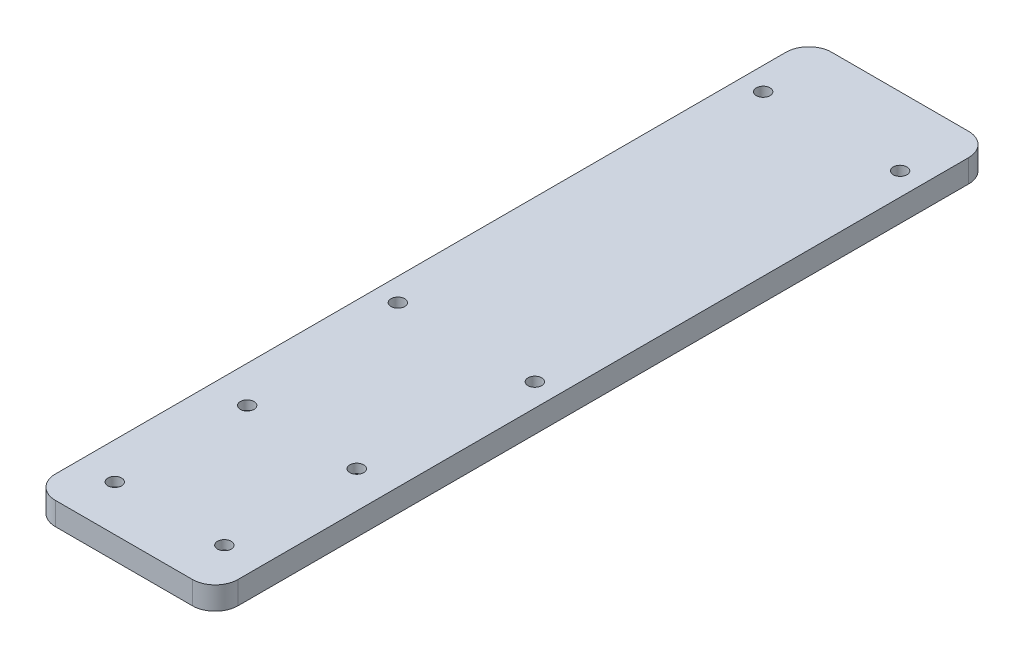
ISO-10303-21;
HEADER;
FILE_DESCRIPTION(('STEP AP214'),'2;1');
FILE_NAME('part.step','',(''),(''),'','','');
FILE_SCHEMA(('AUTOMOTIVE_DESIGN { 1 0 10303 214 1 1 1 1 }'));
ENDSEC;
DATA;
#1=APPLICATION_CONTEXT('core data for automotive mechanical design processes');
#2=APPLICATION_PROTOCOL_DEFINITION('international standard','automotive_design',2000,#1);
#3=PRODUCT_CONTEXT('',#1,'mechanical');
#4=PRODUCT('Part','Part','',(#3));
#5=PRODUCT_RELATED_PRODUCT_CATEGORY('part','',(#4));
#6=PRODUCT_DEFINITION_FORMATION('','',#4);
#7=PRODUCT_DEFINITION_CONTEXT('part definition',#1,'design');
#8=PRODUCT_DEFINITION('design','',#6,#7);
#9=PRODUCT_DEFINITION_SHAPE('','',#8);
#10=(LENGTH_UNIT() NAMED_UNIT(*) SI_UNIT(.MILLI.,.METRE.));
#11=(NAMED_UNIT(*) PLANE_ANGLE_UNIT() SI_UNIT($,.RADIAN.));
#12=(NAMED_UNIT(*) SI_UNIT($,.STERADIAN.) SOLID_ANGLE_UNIT());
#13=UNCERTAINTY_MEASURE_WITH_UNIT(LENGTH_MEASURE(1.E-05),#10,'distance_accuracy_value','');
#14=(GEOMETRIC_REPRESENTATION_CONTEXT(3) GLOBAL_UNCERTAINTY_ASSIGNED_CONTEXT((#13)) GLOBAL_UNIT_ASSIGNED_CONTEXT((#10,
#11,#12)) REPRESENTATION_CONTEXT('',''));
#15=CARTESIAN_POINT('',(0.,0.,0.));
#16=DIRECTION('',(0.,0.,1.));
#17=DIRECTION('',(1.,0.,0.));
#18=AXIS2_PLACEMENT_3D('',#15,#16,#17);
#19=CARTESIAN_POINT('',(12.,5.,46.));
#20=DIRECTION('',(0.,-1.,0.));
#21=DIRECTION('',(0.,0.,-1.));
#22=AXIS2_PLACEMENT_3D('',#19,#20,#21);
#23=CYLINDRICAL_SURFACE('',#22,1.5);
#24=CARTESIAN_POINT('',(12.,5.,46.));
#25=DIRECTION('',(0.,1.,0.));
#26=DIRECTION('',(0.,0.,1.));
#27=AXIS2_PLACEMENT_3D('',#24,#25,#26);
#28=CIRCLE('',#27,1.5);
#29=CARTESIAN_POINT('',(12.,5.,47.5));
#30=VERTEX_POINT('',#29);
#31=EDGE_CURVE('E222',#30,#30,#28,.T.);
#32=ORIENTED_EDGE('',*,*,#31,.T.);
#33=EDGE_LOOP('',(#32));
#34=FACE_BOUND('',#33,.T.);
#35=CARTESIAN_POINT('',(12.,3.,46.));
#36=DIRECTION('',(0.,-1.,0.));
#37=DIRECTION('',(0.,0.,-1.));
#38=AXIS2_PLACEMENT_3D('',#35,#36,#37);
#39=CIRCLE('',#38,1.5);
#40=CARTESIAN_POINT('',(12.,3.,44.5));
#41=VERTEX_POINT('',#40);
#42=EDGE_CURVE('E47',#41,#41,#39,.T.);
#43=ORIENTED_EDGE('',*,*,#42,.T.);
#44=EDGE_LOOP('',(#43));
#45=FACE_BOUND('',#44,.T.);
#46=ADVANCED_FACE('F43',(#34,#45),#23,.F.);
#47=CARTESIAN_POINT('',(-12.,5.,46.0000000000002));
#48=DIRECTION('',(0.,-1.,0.));
#49=DIRECTION('',(0.,0.,-1.));
#50=AXIS2_PLACEMENT_3D('',#47,#48,#49);
#51=CYLINDRICAL_SURFACE('',#50,1.5);
#52=CARTESIAN_POINT('',(-12.,5.,46.0000000000002));
#53=DIRECTION('',(0.,1.,0.));
#54=DIRECTION('',(0.,0.,1.));
#55=AXIS2_PLACEMENT_3D('',#52,#53,#54);
#56=CIRCLE('',#55,1.5);
#57=CARTESIAN_POINT('',(-12.,5.,47.5000000000002));
#58=VERTEX_POINT('',#57);
#59=EDGE_CURVE('E213',#58,#58,#56,.T.);
#60=ORIENTED_EDGE('',*,*,#59,.T.);
#61=EDGE_LOOP('',(#60));
#62=FACE_BOUND('',#61,.T.);
#63=CARTESIAN_POINT('',(-12.,3.,46.0000000000002));
#64=DIRECTION('',(0.,-1.,0.));
#65=DIRECTION('',(0.,0.,-1.));
#66=AXIS2_PLACEMENT_3D('',#63,#64,#65);
#67=CIRCLE('',#66,1.5);
#68=CARTESIAN_POINT('',(-12.,3.,44.5000000000002));
#69=VERTEX_POINT('',#68);
#70=EDGE_CURVE('E195',#69,#69,#67,.T.);
#71=ORIENTED_EDGE('',*,*,#70,.T.);
#72=EDGE_LOOP('',(#71));
#73=FACE_BOUND('',#72,.T.);
#74=ADVANCED_FACE('F295',(#62,#73),#51,.F.);
#75=CARTESIAN_POINT('',(-11.9999999999997,5.,75.0000000000002));
#76=DIRECTION('',(0.,-1.,0.));
#77=DIRECTION('',(0.,0.,-1.));
#78=AXIS2_PLACEMENT_3D('',#75,#76,#77);
#79=CYLINDRICAL_SURFACE('',#78,1.5);
#80=CARTESIAN_POINT('',(-11.9999999999997,5.,75.0000000000002));
#81=DIRECTION('',(0.,1.,0.));
#82=DIRECTION('',(0.,0.,1.));
#83=AXIS2_PLACEMENT_3D('',#80,#81,#82);
#84=CIRCLE('',#83,1.5);
#85=CARTESIAN_POINT('',(-11.9999999999997,5.,76.5000000000002));
#86=VERTEX_POINT('',#85);
#87=EDGE_CURVE('E207',#86,#86,#84,.T.);
#88=ORIENTED_EDGE('',*,*,#87,.T.);
#89=EDGE_LOOP('',(#88));
#90=FACE_BOUND('',#89,.T.);
#91=CARTESIAN_POINT('',(-11.9999999999997,3.,75.0000000000002));
#92=DIRECTION('',(0.,-1.,0.));
#93=DIRECTION('',(0.,0.,-1.));
#94=AXIS2_PLACEMENT_3D('',#91,#92,#93);
#95=CIRCLE('',#94,1.5);
#96=CARTESIAN_POINT('',(-11.9999999999997,3.,73.5000000000002));
#97=VERTEX_POINT('',#96);
#98=EDGE_CURVE('E191',#97,#97,#95,.T.);
#99=ORIENTED_EDGE('',*,*,#98,.T.);
#100=EDGE_LOOP('',(#99));
#101=FACE_BOUND('',#100,.T.);
#102=ADVANCED_FACE('F301',(#90,#101),#79,.F.);
#103=CARTESIAN_POINT('',(12.0000000000003,5.,75.));
#104=DIRECTION('',(0.,-1.,0.));
#105=DIRECTION('',(0.,0.,-1.));
#106=AXIS2_PLACEMENT_3D('',#103,#104,#105);
#107=CYLINDRICAL_SURFACE('',#106,1.5);
#108=CARTESIAN_POINT('',(12.0000000000003,5.,75.));
#109=DIRECTION('',(0.,1.,0.));
#110=DIRECTION('',(0.,0.,1.));
#111=AXIS2_PLACEMENT_3D('',#108,#109,#110);
#112=CIRCLE('',#111,1.5);
#113=CARTESIAN_POINT('',(12.0000000000003,5.,76.5));
#114=VERTEX_POINT('',#113);
#115=EDGE_CURVE('E202',#114,#114,#112,.T.);
#116=ORIENTED_EDGE('',*,*,#115,.T.);
#117=EDGE_LOOP('',(#116));
#118=FACE_BOUND('',#117,.T.);
#119=CARTESIAN_POINT('',(12.0000000000003,3.,75.));
#120=DIRECTION('',(0.,-1.,0.));
#121=DIRECTION('',(0.,0.,-1.));
#122=AXIS2_PLACEMENT_3D('',#119,#120,#121);
#123=CIRCLE('',#122,1.5);
#124=CARTESIAN_POINT('',(12.0000000000003,3.,73.5));
#125=VERTEX_POINT('',#124);
#126=EDGE_CURVE('E187',#125,#125,#123,.T.);
#127=ORIENTED_EDGE('',*,*,#126,.T.);
#128=EDGE_LOOP('',(#127));
#129=FACE_BOUND('',#128,.T.);
#130=ADVANCED_FACE('F324',(#118,#129),#107,.F.);
#131=CARTESIAN_POINT('',(0.,5.,0.));
#132=DIRECTION('',(0.,1.,0.));
#133=DIRECTION('',(0.,0.,1.));
#134=AXIS2_PLACEMENT_3D('',#131,#132,#133);
#135=PLANE('',#134);
#136=ORIENTED_EDGE('',*,*,#87,.F.);
#137=EDGE_LOOP('',(#136));
#138=FACE_BOUND('',#137,.T.);
#139=ORIENTED_EDGE('',*,*,#31,.F.);
#140=EDGE_LOOP('',(#139));
#141=FACE_BOUND('',#140,.T.);
#142=CARTESIAN_POINT('',(15.0000000000008,5.,10.));
#143=DIRECTION('',(0.,1.,0.));
#144=DIRECTION('',(0.,0.,1.));
#145=AXIS2_PLACEMENT_3D('',#142,#143,#144);
#146=CIRCLE('',#145,1.5);
#147=CARTESIAN_POINT('',(15.0000000000008,5.,11.5));
#148=VERTEX_POINT('',#147);
#149=EDGE_CURVE('E235',#148,#148,#146,.T.);
#150=ORIENTED_EDGE('',*,*,#149,.F.);
#151=EDGE_LOOP('',(#150));
#152=FACE_BOUND('',#151,.T.);
#153=CARTESIAN_POINT('',(-15.,5.,-70.));
#154=DIRECTION('',(0.,1.,0.));
#155=DIRECTION('',(0.,0.,1.));
#156=AXIS2_PLACEMENT_3D('',#153,#154,#155);
#157=CIRCLE('',#156,1.5);
#158=CARTESIAN_POINT('',(-15.,5.,-68.5));
#159=VERTEX_POINT('',#158);
#160=EDGE_CURVE('E251',#159,#159,#157,.T.);
#161=ORIENTED_EDGE('',*,*,#160,.F.);
#162=EDGE_LOOP('',(#161));
#163=FACE_BOUND('',#162,.T.);
#164=DIRECTION('',(-1.,0.,0.));
#165=VECTOR('',#164,1.);
#166=CARTESIAN_POINT('',(-20.,5.,-85.));
#167=LINE('',#166,#165);
#168=CARTESIAN_POINT('',(15.,5.,-85.));
#169=VERTEX_POINT('',#168);
#170=CARTESIAN_POINT('',(-15.,5.,-85.));
#171=VERTEX_POINT('',#170);
#172=EDGE_CURVE('E261',#169,#171,#167,.T.);
#173=ORIENTED_EDGE('',*,*,#172,.T.);
#174=CARTESIAN_POINT('',(-15.,5.,-80.));
#175=DIRECTION('',(0.,1.,0.));
#176=DIRECTION('',(0.,0.,1.));
#177=AXIS2_PLACEMENT_3D('',#174,#175,#176);
#178=CIRCLE('',#177,5.);
#179=CARTESIAN_POINT('',(-20.,5.,-80.));
#180=VERTEX_POINT('',#179);
#181=EDGE_CURVE('E174',#171,#180,#178,.T.);
#182=ORIENTED_EDGE('',*,*,#181,.T.);
#183=DIRECTION('',(0.,0.,1.));
#184=VECTOR('',#183,1.);
#185=CARTESIAN_POINT('',(-20.,5.,-85.));
#186=LINE('',#185,#184);
#187=CARTESIAN_POINT('',(-20.,5.,80.));
#188=VERTEX_POINT('',#187);
#189=EDGE_CURVE('E131',#180,#188,#186,.T.);
#190=ORIENTED_EDGE('',*,*,#189,.T.);
#191=CARTESIAN_POINT('',(-15.,5.,80.));
#192=DIRECTION('',(0.,1.,0.));
#193=DIRECTION('',(0.,0.,1.));
#194=AXIS2_PLACEMENT_3D('',#191,#192,#193);
#195=CIRCLE('',#194,5.);
#196=CARTESIAN_POINT('',(-15.,5.,85.));
#197=VERTEX_POINT('',#196);
#198=EDGE_CURVE('E66',#188,#197,#195,.T.);
#199=ORIENTED_EDGE('',*,*,#198,.T.);
#200=DIRECTION('',(1.,0.,0.));
#201=VECTOR('',#200,1.);
#202=CARTESIAN_POINT('',(-20.,5.,85.));
#203=LINE('',#202,#201);
#204=CARTESIAN_POINT('',(15.,5.,85.));
#205=VERTEX_POINT('',#204);
#206=EDGE_CURVE('E152',#197,#205,#203,.T.);
#207=ORIENTED_EDGE('',*,*,#206,.T.);
#208=CARTESIAN_POINT('',(15.,5.,80.));
#209=DIRECTION('',(0.,1.,0.));
#210=DIRECTION('',(0.,0.,1.));
#211=AXIS2_PLACEMENT_3D('',#208,#209,#210);
#212=CIRCLE('',#211,5.);
#213=CARTESIAN_POINT('',(20.,5.,80.));
#214=VERTEX_POINT('',#213);
#215=EDGE_CURVE('E168',#205,#214,#212,.T.);
#216=ORIENTED_EDGE('',*,*,#215,.T.);
#217=DIRECTION('',(0.,0.,-1.));
#218=VECTOR('',#217,1.);
#219=CARTESIAN_POINT('',(20.,5.,-85.));
#220=LINE('',#219,#218);
#221=CARTESIAN_POINT('',(20.,5.,-80.));
#222=VERTEX_POINT('',#221);
#223=EDGE_CURVE('E145',#214,#222,#220,.T.);
#224=ORIENTED_EDGE('',*,*,#223,.T.);
#225=CARTESIAN_POINT('',(15.,5.,-80.));
#226=DIRECTION('',(0.,1.,0.));
#227=DIRECTION('',(0.,0.,1.));
#228=AXIS2_PLACEMENT_3D('',#225,#226,#227);
#229=CIRCLE('',#228,5.);
#230=EDGE_CURVE('E171',#222,#169,#229,.T.);
#231=ORIENTED_EDGE('',*,*,#230,.T.);
#232=EDGE_LOOP('',(#173,#182,#190,#199,#207,#216,#224,#231));
#233=FACE_BOUND('',#232,.T.);
#234=CARTESIAN_POINT('',(15.,5.,-70.));
#235=DIRECTION('',(0.,1.,0.));
#236=DIRECTION('',(0.,0.,1.));
#237=AXIS2_PLACEMENT_3D('',#234,#235,#236);
#238=CIRCLE('',#237,1.5);
#239=CARTESIAN_POINT('',(15.,5.,-68.5));
#240=VERTEX_POINT('',#239);
#241=EDGE_CURVE('E243',#240,#240,#238,.T.);
#242=ORIENTED_EDGE('',*,*,#241,.F.);
#243=EDGE_LOOP('',(#242));
#244=FACE_BOUND('',#243,.T.);
#245=CARTESIAN_POINT('',(-14.9999999999992,5.,10.));
#246=DIRECTION('',(0.,1.,0.));
#247=DIRECTION('',(0.,0.,1.));
#248=AXIS2_PLACEMENT_3D('',#245,#246,#247);
#249=CIRCLE('',#248,1.5);
#250=CARTESIAN_POINT('',(-14.9999999999992,5.,11.5));
#251=VERTEX_POINT('',#250);
#252=EDGE_CURVE('E227',#251,#251,#249,.T.);
#253=ORIENTED_EDGE('',*,*,#252,.F.);
#254=EDGE_LOOP('',(#253));
#255=FACE_BOUND('',#254,.T.);
#256=ORIENTED_EDGE('',*,*,#59,.F.);
#257=EDGE_LOOP('',(#256));
#258=FACE_BOUND('',#257,.T.);
#259=ORIENTED_EDGE('',*,*,#115,.F.);
#260=EDGE_LOOP('',(#259));
#261=FACE_BOUND('',#260,.T.);
#262=ADVANCED_FACE('F281',(#138,#141,#152,#163,#233,#244,#255,#258,#261),#135,.T.);
#263=CARTESIAN_POINT('',(0.,0.,0.));
#264=DIRECTION('',(0.,1.,0.));
#265=DIRECTION('',(0.,0.,1.));
#266=AXIS2_PLACEMENT_3D('',#263,#264,#265);
#267=PLANE('',#266);
#268=CARTESIAN_POINT('',(-11.9999999999994,0.,46.0000000000002));
#269=DIRECTION('',(0.,-1.,0.));
#270=DIRECTION('',(0.,0.,-1.));
#271=AXIS2_PLACEMENT_3D('',#268,#269,#270);
#272=CIRCLE('',#271,3.);
#273=CARTESIAN_POINT('',(-11.9999999999994,0.,43.0000000000002));
#274=VERTEX_POINT('',#273);
#275=EDGE_CURVE('E507',#274,#274,#272,.T.);
#276=ORIENTED_EDGE('',*,*,#275,.F.);
#277=EDGE_LOOP('',(#276));
#278=FACE_BOUND('',#277,.T.);
#279=CARTESIAN_POINT('',(12.0000000000006,0.,46.0000000000002));
#280=DIRECTION('',(0.,-1.,0.));
#281=DIRECTION('',(0.,0.,-1.));
#282=AXIS2_PLACEMENT_3D('',#279,#280,#281);
#283=CIRCLE('',#282,3.);
#284=CARTESIAN_POINT('',(12.0000000000006,0.,43.0000000000002));
#285=VERTEX_POINT('',#284);
#286=EDGE_CURVE('E506',#285,#285,#283,.T.);
#287=ORIENTED_EDGE('',*,*,#286,.F.);
#288=EDGE_LOOP('',(#287));
#289=FACE_BOUND('',#288,.T.);
#290=CARTESIAN_POINT('',(12.0000000000003,0.,75.0000000000002));
#291=DIRECTION('',(0.,-1.,0.));
#292=DIRECTION('',(0.,0.,-1.));
#293=AXIS2_PLACEMENT_3D('',#290,#291,#292);
#294=CIRCLE('',#293,3.);
#295=CARTESIAN_POINT('',(12.0000000000003,0.,72.0000000000002));
#296=VERTEX_POINT('',#295);
#297=EDGE_CURVE('E527',#296,#296,#294,.T.);
#298=ORIENTED_EDGE('',*,*,#297,.F.);
#299=EDGE_LOOP('',(#298));
#300=FACE_BOUND('',#299,.T.);
#301=CARTESIAN_POINT('',(-11.9999999999997,0.,75.0000000000002));
#302=DIRECTION('',(0.,-1.,0.));
#303=DIRECTION('',(0.,0.,-1.));
#304=AXIS2_PLACEMENT_3D('',#301,#302,#303);
#305=CIRCLE('',#304,3.);
#306=CARTESIAN_POINT('',(-11.9999999999997,0.,72.0000000000002));
#307=VERTEX_POINT('',#306);
#308=EDGE_CURVE('E216',#307,#307,#305,.T.);
#309=ORIENTED_EDGE('',*,*,#308,.F.);
#310=EDGE_LOOP('',(#309));
#311=FACE_BOUND('',#310,.T.);
#312=DIRECTION('',(0.,0.,1.));
#313=VECTOR('',#312,1.);
#314=CARTESIAN_POINT('',(-20.,0.,-85.));
#315=LINE('',#314,#313);
#316=CARTESIAN_POINT('',(-20.,0.,-80.));
#317=VERTEX_POINT('',#316);
#318=CARTESIAN_POINT('',(-20.,0.,80.));
#319=VERTEX_POINT('',#318);
#320=EDGE_CURVE('E129',#317,#319,#315,.T.);
#321=ORIENTED_EDGE('',*,*,#320,.F.);
#322=CARTESIAN_POINT('',(-15.,0.,-80.));
#323=DIRECTION('',(0.,1.,0.));
#324=DIRECTION('',(0.,0.,1.));
#325=AXIS2_PLACEMENT_3D('',#322,#323,#324);
#326=CIRCLE('',#325,5.);
#327=CARTESIAN_POINT('',(-15.,0.,-85.));
#328=VERTEX_POINT('',#327);
#329=EDGE_CURVE('E111',#317,#328,#326,.F.);
#330=ORIENTED_EDGE('',*,*,#329,.T.);
#331=DIRECTION('',(-1.,0.,0.));
#332=VECTOR('',#331,1.);
#333=CARTESIAN_POINT('',(-20.,0.,-85.));
#334=LINE('',#333,#332);
#335=CARTESIAN_POINT('',(15.,0.,-85.));
#336=VERTEX_POINT('',#335);
#337=EDGE_CURVE('E141',#336,#328,#334,.T.);
#338=ORIENTED_EDGE('',*,*,#337,.F.);
#339=CARTESIAN_POINT('',(15.,0.,-80.));
#340=DIRECTION('',(0.,1.,0.));
#341=DIRECTION('',(0.,0.,1.));
#342=AXIS2_PLACEMENT_3D('',#339,#340,#341);
#343=CIRCLE('',#342,5.);
#344=CARTESIAN_POINT('',(20.,0.,-80.));
#345=VERTEX_POINT('',#344);
#346=EDGE_CURVE('E123',#336,#345,#343,.F.);
#347=ORIENTED_EDGE('',*,*,#346,.T.);
#348=DIRECTION('',(0.,0.,-1.));
#349=VECTOR('',#348,1.);
#350=CARTESIAN_POINT('',(20.,0.,-85.));
#351=LINE('',#350,#349);
#352=CARTESIAN_POINT('',(20.,0.,80.));
#353=VERTEX_POINT('',#352);
#354=EDGE_CURVE('E147',#353,#345,#351,.T.);
#355=ORIENTED_EDGE('',*,*,#354,.F.);
#356=CARTESIAN_POINT('',(15.,0.,80.));
#357=DIRECTION('',(0.,1.,0.));
#358=DIRECTION('',(0.,0.,1.));
#359=AXIS2_PLACEMENT_3D('',#356,#357,#358);
#360=CIRCLE('',#359,5.);
#361=CARTESIAN_POINT('',(15.,0.,85.));
#362=VERTEX_POINT('',#361);
#363=EDGE_CURVE('E156',#353,#362,#360,.F.);
#364=ORIENTED_EDGE('',*,*,#363,.T.);
#365=DIRECTION('',(1.,0.,0.));
#366=VECTOR('',#365,1.);
#367=CARTESIAN_POINT('',(-20.,0.,85.));
#368=LINE('',#367,#366);
#369=CARTESIAN_POINT('',(-15.,0.,85.));
#370=VERTEX_POINT('',#369);
#371=EDGE_CURVE('E140',#370,#362,#368,.T.);
#372=ORIENTED_EDGE('',*,*,#371,.F.);
#373=CARTESIAN_POINT('',(-15.,0.,80.));
#374=DIRECTION('',(0.,1.,0.));
#375=DIRECTION('',(0.,0.,1.));
#376=AXIS2_PLACEMENT_3D('',#373,#374,#375);
#377=CIRCLE('',#376,5.);
#378=EDGE_CURVE('E133',#370,#319,#377,.F.);
#379=ORIENTED_EDGE('',*,*,#378,.T.);
#380=EDGE_LOOP('',(#321,#330,#338,#347,#355,#364,#372,#379));
#381=FACE_BOUND('',#380,.T.);
#382=CARTESIAN_POINT('',(-15.,0.,-70.));
#383=DIRECTION('',(0.,1.,0.));
#384=DIRECTION('',(0.,0.,1.));
#385=AXIS2_PLACEMENT_3D('',#382,#383,#384);
#386=CIRCLE('',#385,1.5);
#387=CARTESIAN_POINT('',(-15.,0.,-68.5));
#388=VERTEX_POINT('',#387);
#389=EDGE_CURVE('E247',#388,#388,#386,.T.);
#390=ORIENTED_EDGE('',*,*,#389,.T.);
#391=EDGE_LOOP('',(#390));
#392=FACE_BOUND('',#391,.T.);
#393=CARTESIAN_POINT('',(15.,0.,-70.));
#394=DIRECTION('',(0.,1.,0.));
#395=DIRECTION('',(0.,0.,1.));
#396=AXIS2_PLACEMENT_3D('',#393,#394,#395);
#397=CIRCLE('',#396,1.5);
#398=CARTESIAN_POINT('',(15.,0.,-68.5));
#399=VERTEX_POINT('',#398);
#400=EDGE_CURVE('E239',#399,#399,#397,.T.);
#401=ORIENTED_EDGE('',*,*,#400,.T.);
#402=EDGE_LOOP('',(#401));
#403=FACE_BOUND('',#402,.T.);
#404=CARTESIAN_POINT('',(15.0000000000008,0.,10.));
#405=DIRECTION('',(0.,1.,0.));
#406=DIRECTION('',(0.,0.,1.));
#407=AXIS2_PLACEMENT_3D('',#404,#405,#406);
#408=CIRCLE('',#407,1.5);
#409=CARTESIAN_POINT('',(15.0000000000008,0.,11.5));
#410=VERTEX_POINT('',#409);
#411=EDGE_CURVE('E231',#410,#410,#408,.T.);
#412=ORIENTED_EDGE('',*,*,#411,.T.);
#413=EDGE_LOOP('',(#412));
#414=FACE_BOUND('',#413,.T.);
#415=CARTESIAN_POINT('',(-14.9999999999992,0.,10.));
#416=DIRECTION('',(0.,1.,0.));
#417=DIRECTION('',(0.,0.,1.));
#418=AXIS2_PLACEMENT_3D('',#415,#416,#417);
#419=CIRCLE('',#418,1.5);
#420=CARTESIAN_POINT('',(-14.9999999999992,0.,11.5));
#421=VERTEX_POINT('',#420);
#422=EDGE_CURVE('E226',#421,#421,#419,.T.);
#423=ORIENTED_EDGE('',*,*,#422,.T.);
#424=EDGE_LOOP('',(#423));
#425=FACE_BOUND('',#424,.T.);
#426=ADVANCED_FACE('F136',(#278,#289,#300,#311,#381,#392,#403,#414,#425),#267,.F.);
#427=CARTESIAN_POINT('',(20.,5.,-85.));
#428=DIRECTION('',(-1.,0.,0.));
#429=DIRECTION('',(0.,0.,1.));
#430=AXIS2_PLACEMENT_3D('',#427,#428,#429);
#431=PLANE('',#430);
#432=ORIENTED_EDGE('',*,*,#354,.T.);
#433=DIRECTION('',(0.,-1.,0.));
#434=VECTOR('',#433,1.);
#435=CARTESIAN_POINT('',(20.,5.,-80.));
#436=LINE('',#435,#434);
#437=EDGE_CURVE('E181',#345,#222,#436,.F.);
#438=ORIENTED_EDGE('',*,*,#437,.T.);
#439=ORIENTED_EDGE('',*,*,#223,.F.);
#440=DIRECTION('',(0.,-1.,0.));
#441=VECTOR('',#440,1.);
#442=CARTESIAN_POINT('',(20.,5.,80.));
#443=LINE('',#442,#441);
#444=EDGE_CURVE('E177',#214,#353,#443,.T.);
#445=ORIENTED_EDGE('',*,*,#444,.T.);
#446=EDGE_LOOP('',(#432,#438,#439,#445));
#447=FACE_BOUND('',#446,.T.);
#448=ADVANCED_FACE('F273',(#447),#431,.F.);
#449=CARTESIAN_POINT('',(-20.,5.,-85.));
#450=DIRECTION('',(0.,0.,1.));
#451=DIRECTION('',(1.,0.,0.));
#452=AXIS2_PLACEMENT_3D('',#449,#450,#451);
#453=PLANE('',#452);
#454=ORIENTED_EDGE('',*,*,#337,.T.);
#455=DIRECTION('',(0.,-1.,0.));
#456=VECTOR('',#455,1.);
#457=CARTESIAN_POINT('',(-15.,5.,-85.));
#458=LINE('',#457,#456);
#459=EDGE_CURVE('E116',#328,#171,#458,.F.);
#460=ORIENTED_EDGE('',*,*,#459,.T.);
#461=ORIENTED_EDGE('',*,*,#172,.F.);
#462=DIRECTION('',(0.,-1.,0.));
#463=VECTOR('',#462,1.);
#464=CARTESIAN_POINT('',(15.,5.,-85.));
#465=LINE('',#464,#463);
#466=EDGE_CURVE('E122',#169,#336,#465,.T.);
#467=ORIENTED_EDGE('',*,*,#466,.T.);
#468=EDGE_LOOP('',(#454,#460,#461,#467));
#469=FACE_BOUND('',#468,.T.);
#470=ADVANCED_FACE('F284',(#469),#453,.F.);
#471=CARTESIAN_POINT('',(-20.,5.,-85.));
#472=DIRECTION('',(1.,0.,0.));
#473=DIRECTION('',(0.,0.,-1.));
#474=AXIS2_PLACEMENT_3D('',#471,#472,#473);
#475=PLANE('',#474);
#476=ORIENTED_EDGE('',*,*,#189,.F.);
#477=DIRECTION('',(0.,-1.,0.));
#478=VECTOR('',#477,1.);
#479=CARTESIAN_POINT('',(-20.,5.,-80.));
#480=LINE('',#479,#478);
#481=EDGE_CURVE('E115',#180,#317,#480,.T.);
#482=ORIENTED_EDGE('',*,*,#481,.T.);
#483=ORIENTED_EDGE('',*,*,#320,.T.);
#484=DIRECTION('',(0.,-1.,0.));
#485=VECTOR('',#484,1.);
#486=CARTESIAN_POINT('',(-20.,5.,80.));
#487=LINE('',#486,#485);
#488=EDGE_CURVE('E134',#319,#188,#487,.F.);
#489=ORIENTED_EDGE('',*,*,#488,.T.);
#490=EDGE_LOOP('',(#476,#482,#483,#489));
#491=FACE_BOUND('',#490,.T.);
#492=ADVANCED_FACE('F128',(#491),#475,.F.);
#493=CARTESIAN_POINT('',(-20.,5.,85.));
#494=DIRECTION('',(0.,0.,-1.));
#495=DIRECTION('',(-1.,0.,0.));
#496=AXIS2_PLACEMENT_3D('',#493,#494,#495);
#497=PLANE('',#496);
#498=ORIENTED_EDGE('',*,*,#371,.T.);
#499=DIRECTION('',(0.,-1.,0.));
#500=VECTOR('',#499,1.);
#501=CARTESIAN_POINT('',(15.,5.,85.));
#502=LINE('',#501,#500);
#503=EDGE_CURVE('E11',#362,#205,#502,.F.);
#504=ORIENTED_EDGE('',*,*,#503,.T.);
#505=ORIENTED_EDGE('',*,*,#206,.F.);
#506=DIRECTION('',(0.,-1.,0.));
#507=VECTOR('',#506,1.);
#508=CARTESIAN_POINT('',(-15.,5.,85.));
#509=LINE('',#508,#507);
#510=EDGE_CURVE('E53',#197,#370,#509,.T.);
#511=ORIENTED_EDGE('',*,*,#510,.T.);
#512=EDGE_LOOP('',(#498,#504,#505,#511));
#513=FACE_BOUND('',#512,.T.);
#514=ADVANCED_FACE('F291',(#513),#497,.F.);
#515=CARTESIAN_POINT('',(-15.,5.,-70.));
#516=DIRECTION('',(0.,-1.,0.));
#517=DIRECTION('',(0.,0.,-1.));
#518=AXIS2_PLACEMENT_3D('',#515,#516,#517);
#519=CYLINDRICAL_SURFACE('',#518,1.5);
#520=ORIENTED_EDGE('',*,*,#160,.T.);
#521=EDGE_LOOP('',(#520));
#522=FACE_BOUND('',#521,.T.);
#523=ORIENTED_EDGE('',*,*,#389,.F.);
#524=EDGE_LOOP('',(#523));
#525=FACE_BOUND('',#524,.T.);
#526=ADVANCED_FACE('F317',(#522,#525),#519,.F.);
#527=CARTESIAN_POINT('',(15.,5.,-70.));
#528=DIRECTION('',(0.,-1.,0.));
#529=DIRECTION('',(0.,0.,-1.));
#530=AXIS2_PLACEMENT_3D('',#527,#528,#529);
#531=CYLINDRICAL_SURFACE('',#530,1.5);
#532=ORIENTED_EDGE('',*,*,#241,.T.);
#533=EDGE_LOOP('',(#532));
#534=FACE_BOUND('',#533,.T.);
#535=ORIENTED_EDGE('',*,*,#400,.F.);
#536=EDGE_LOOP('',(#535));
#537=FACE_BOUND('',#536,.T.);
#538=ADVANCED_FACE('F313',(#534,#537),#531,.F.);
#539=CARTESIAN_POINT('',(15.0000000000008,5.,10.));
#540=DIRECTION('',(0.,-1.,0.));
#541=DIRECTION('',(0.,0.,-1.));
#542=AXIS2_PLACEMENT_3D('',#539,#540,#541);
#543=CYLINDRICAL_SURFACE('',#542,1.5);
#544=ORIENTED_EDGE('',*,*,#149,.T.);
#545=EDGE_LOOP('',(#544));
#546=FACE_BOUND('',#545,.T.);
#547=ORIENTED_EDGE('',*,*,#411,.F.);
#548=EDGE_LOOP('',(#547));
#549=FACE_BOUND('',#548,.T.);
#550=ADVANCED_FACE('F309',(#546,#549),#543,.F.);
#551=CARTESIAN_POINT('',(-14.9999999999992,5.,10.));
#552=DIRECTION('',(0.,-1.,0.));
#553=DIRECTION('',(0.,0.,-1.));
#554=AXIS2_PLACEMENT_3D('',#551,#552,#553);
#555=CYLINDRICAL_SURFACE('',#554,1.5);
#556=ORIENTED_EDGE('',*,*,#252,.T.);
#557=EDGE_LOOP('',(#556));
#558=FACE_BOUND('',#557,.T.);
#559=ORIENTED_EDGE('',*,*,#422,.F.);
#560=EDGE_LOOP('',(#559));
#561=FACE_BOUND('',#560,.T.);
#562=ADVANCED_FACE('F306',(#558,#561),#555,.F.);
#563=CARTESIAN_POINT('',(-15.,5.,-80.));
#564=DIRECTION('',(0.,-1.,0.));
#565=DIRECTION('',(0.,0.,-1.));
#566=AXIS2_PLACEMENT_3D('',#563,#564,#565);
#567=CYLINDRICAL_SURFACE('',#566,5.);
#568=ORIENTED_EDGE('',*,*,#181,.F.);
#569=ORIENTED_EDGE('',*,*,#459,.F.);
#570=ORIENTED_EDGE('',*,*,#329,.F.);
#571=ORIENTED_EDGE('',*,*,#481,.F.);
#572=EDGE_LOOP('',(#568,#569,#570,#571));
#573=FACE_BOUND('',#572,.T.);
#574=ADVANCED_FACE('F114',(#573),#567,.T.);
#575=CARTESIAN_POINT('',(15.,5.,-80.));
#576=DIRECTION('',(0.,-1.,0.));
#577=DIRECTION('',(0.,0.,-1.));
#578=AXIS2_PLACEMENT_3D('',#575,#576,#577);
#579=CYLINDRICAL_SURFACE('',#578,5.);
#580=ORIENTED_EDGE('',*,*,#230,.F.);
#581=ORIENTED_EDGE('',*,*,#437,.F.);
#582=ORIENTED_EDGE('',*,*,#346,.F.);
#583=ORIENTED_EDGE('',*,*,#466,.F.);
#584=EDGE_LOOP('',(#580,#581,#582,#583));
#585=FACE_BOUND('',#584,.T.);
#586=ADVANCED_FACE('F278',(#585),#579,.T.);
#587=CARTESIAN_POINT('',(15.,5.,80.));
#588=DIRECTION('',(0.,-1.,0.));
#589=DIRECTION('',(0.,0.,-1.));
#590=AXIS2_PLACEMENT_3D('',#587,#588,#589);
#591=CYLINDRICAL_SURFACE('',#590,5.);
#592=ORIENTED_EDGE('',*,*,#215,.F.);
#593=ORIENTED_EDGE('',*,*,#503,.F.);
#594=ORIENTED_EDGE('',*,*,#363,.F.);
#595=ORIENTED_EDGE('',*,*,#444,.F.);
#596=EDGE_LOOP('',(#592,#593,#594,#595));
#597=FACE_BOUND('',#596,.T.);
#598=ADVANCED_FACE('F335',(#597),#591,.T.);
#599=CARTESIAN_POINT('',(-15.,5.,80.));
#600=DIRECTION('',(0.,-1.,0.));
#601=DIRECTION('',(0.,0.,-1.));
#602=AXIS2_PLACEMENT_3D('',#599,#600,#601);
#603=CYLINDRICAL_SURFACE('',#602,5.);
#604=ORIENTED_EDGE('',*,*,#198,.F.);
#605=ORIENTED_EDGE('',*,*,#488,.F.);
#606=ORIENTED_EDGE('',*,*,#378,.F.);
#607=ORIENTED_EDGE('',*,*,#510,.F.);
#608=EDGE_LOOP('',(#604,#605,#606,#607));
#609=FACE_BOUND('',#608,.T.);
#610=ADVANCED_FACE('F45',(#609),#603,.T.);
#611=CARTESIAN_POINT('',(12.0000000000003,3.,75.0000000000002));
#612=DIRECTION('',(0.,-1.,0.));
#613=DIRECTION('',(0.,0.,-1.));
#614=AXIS2_PLACEMENT_3D('',#611,#612,#613);
#615=CYLINDRICAL_SURFACE('',#614,3.);
#616=CARTESIAN_POINT('',(12.0000000000003,3.,75.0000000000002));
#617=DIRECTION('',(0.,-1.,0.));
#618=DIRECTION('',(0.,0.,-1.));
#619=AXIS2_PLACEMENT_3D('',#616,#617,#618);
#620=CIRCLE('',#619,3.);
#621=CARTESIAN_POINT('',(12.0000000000003,3.,72.0000000000002));
#622=VERTEX_POINT('',#621);
#623=EDGE_CURVE('E512',#622,#622,#620,.T.);
#624=ORIENTED_EDGE('',*,*,#623,.F.);
#625=EDGE_LOOP('',(#624));
#626=FACE_BOUND('',#625,.T.);
#627=ORIENTED_EDGE('',*,*,#297,.T.);
#628=EDGE_LOOP('',(#627));
#629=FACE_BOUND('',#628,.T.);
#630=ADVANCED_FACE('F338',(#626,#629),#615,.F.);
#631=CARTESIAN_POINT('',(12.0000000000003,3.,75.0000000000002));
#632=DIRECTION('',(0.,-1.,0.));
#633=DIRECTION('',(0.,0.,-1.));
#634=AXIS2_PLACEMENT_3D('',#631,#632,#633);
#635=PLANE('',#634);
#636=ORIENTED_EDGE('',*,*,#126,.F.);
#637=EDGE_LOOP('',(#636));
#638=FACE_BOUND('',#637,.T.);
#639=ORIENTED_EDGE('',*,*,#623,.T.);
#640=EDGE_LOOP('',(#639));
#641=FACE_BOUND('',#640,.T.);
#642=ADVANCED_FACE('F343',(#638,#641),#635,.T.);
#643=CARTESIAN_POINT('',(-11.9999999999997,3.,75.0000000000002));
#644=DIRECTION('',(0.,-1.,0.));
#645=DIRECTION('',(0.,0.,-1.));
#646=AXIS2_PLACEMENT_3D('',#643,#644,#645);
#647=CYLINDRICAL_SURFACE('',#646,3.);
#648=CARTESIAN_POINT('',(-11.9999999999997,3.,75.0000000000002));
#649=DIRECTION('',(0.,-1.,0.));
#650=DIRECTION('',(0.,0.,-1.));
#651=AXIS2_PLACEMENT_3D('',#648,#649,#650);
#652=CIRCLE('',#651,3.);
#653=CARTESIAN_POINT('',(-11.9999999999997,3.,72.0000000000002));
#654=VERTEX_POINT('',#653);
#655=EDGE_CURVE('E192',#654,#654,#652,.T.);
#656=ORIENTED_EDGE('',*,*,#655,.F.);
#657=EDGE_LOOP('',(#656));
#658=FACE_BOUND('',#657,.T.);
#659=ORIENTED_EDGE('',*,*,#308,.T.);
#660=EDGE_LOOP('',(#659));
#661=FACE_BOUND('',#660,.T.);
#662=ADVANCED_FACE('F422',(#658,#661),#647,.F.);
#663=CARTESIAN_POINT('',(-11.9999999999997,3.,75.0000000000002));
#664=DIRECTION('',(0.,-1.,0.));
#665=DIRECTION('',(0.,0.,-1.));
#666=AXIS2_PLACEMENT_3D('',#663,#664,#665);
#667=PLANE('',#666);
#668=ORIENTED_EDGE('',*,*,#98,.F.);
#669=EDGE_LOOP('',(#668));
#670=FACE_BOUND('',#669,.T.);
#671=ORIENTED_EDGE('',*,*,#655,.T.);
#672=EDGE_LOOP('',(#671));
#673=FACE_BOUND('',#672,.T.);
#674=ADVANCED_FACE('F433',(#670,#673),#667,.T.);
#675=CARTESIAN_POINT('',(-11.9999999999994,3.,46.0000000000002));
#676=DIRECTION('',(0.,-1.,0.));
#677=DIRECTION('',(0.,0.,-1.));
#678=AXIS2_PLACEMENT_3D('',#675,#676,#677);
#679=CYLINDRICAL_SURFACE('',#678,3.);
#680=CARTESIAN_POINT('',(-11.9999999999994,3.,46.0000000000002));
#681=DIRECTION('',(0.,-1.,0.));
#682=DIRECTION('',(0.,0.,-1.));
#683=AXIS2_PLACEMENT_3D('',#680,#681,#682);
#684=CIRCLE('',#683,3.);
#685=CARTESIAN_POINT('',(-11.9999999999994,3.,43.0000000000002));
#686=VERTEX_POINT('',#685);
#687=EDGE_CURVE('E515',#686,#686,#684,.T.);
#688=ORIENTED_EDGE('',*,*,#687,.F.);
#689=EDGE_LOOP('',(#688));
#690=FACE_BOUND('',#689,.T.);
#691=ORIENTED_EDGE('',*,*,#275,.T.);
#692=EDGE_LOOP('',(#691));
#693=FACE_BOUND('',#692,.T.);
#694=ADVANCED_FACE('F444',(#690,#693),#679,.F.);
#695=CARTESIAN_POINT('',(-11.9999999999994,3.,46.0000000000002));
#696=DIRECTION('',(0.,-1.,0.));
#697=DIRECTION('',(0.,0.,-1.));
#698=AXIS2_PLACEMENT_3D('',#695,#696,#697);
#699=PLANE('',#698);
#700=ORIENTED_EDGE('',*,*,#70,.F.);
#701=EDGE_LOOP('',(#700));
#702=FACE_BOUND('',#701,.T.);
#703=ORIENTED_EDGE('',*,*,#687,.T.);
#704=EDGE_LOOP('',(#703));
#705=FACE_BOUND('',#704,.T.);
#706=ADVANCED_FACE('F455',(#702,#705),#699,.T.);
#707=CARTESIAN_POINT('',(12.0000000000006,3.,46.0000000000002));
#708=DIRECTION('',(0.,-1.,0.));
#709=DIRECTION('',(0.,0.,-1.));
#710=AXIS2_PLACEMENT_3D('',#707,#708,#709);
#711=CYLINDRICAL_SURFACE('',#710,3.);
#712=CARTESIAN_POINT('',(12.0000000000006,3.,46.0000000000002));
#713=DIRECTION('',(0.,-1.,0.));
#714=DIRECTION('',(0.,0.,-1.));
#715=AXIS2_PLACEMENT_3D('',#712,#713,#714);
#716=CIRCLE('',#715,3.);
#717=CARTESIAN_POINT('',(12.0000000000006,3.,43.0000000000002));
#718=VERTEX_POINT('',#717);
#719=EDGE_CURVE('E504',#718,#718,#716,.T.);
#720=ORIENTED_EDGE('',*,*,#719,.F.);
#721=EDGE_LOOP('',(#720));
#722=FACE_BOUND('',#721,.T.);
#723=ORIENTED_EDGE('',*,*,#286,.T.);
#724=EDGE_LOOP('',(#723));
#725=FACE_BOUND('',#724,.T.);
#726=ADVANCED_FACE('F466',(#722,#725),#711,.F.);
#727=CARTESIAN_POINT('',(12.0000000000006,3.,46.0000000000002));
#728=DIRECTION('',(0.,-1.,0.));
#729=DIRECTION('',(0.,0.,-1.));
#730=AXIS2_PLACEMENT_3D('',#727,#728,#729);
#731=PLANE('',#730);
#732=ORIENTED_EDGE('',*,*,#42,.F.);
#733=EDGE_LOOP('',(#732));
#734=FACE_BOUND('',#733,.T.);
#735=ORIENTED_EDGE('',*,*,#719,.T.);
#736=EDGE_LOOP('',(#735));
#737=FACE_BOUND('',#736,.T.);
#738=ADVANCED_FACE('F477',(#734,#737),#731,.T.);
#739=CLOSED_SHELL('',(#46,#74,#102,#130,#262,#426,#448,#470,#492,#514,#526,#538,#550,#562,#574,
#586,#598,#610,#630,#642,#662,#674,#694,#706,#726,#738));
#740=MANIFOLD_SOLID_BREP('B2',#739);
#741=ADVANCED_BREP_SHAPE_REPRESENTATION('',(#18,#740),#14);
#742=SHAPE_DEFINITION_REPRESENTATION(#9,#741);
ENDSEC;
END-ISO-10303-21;
